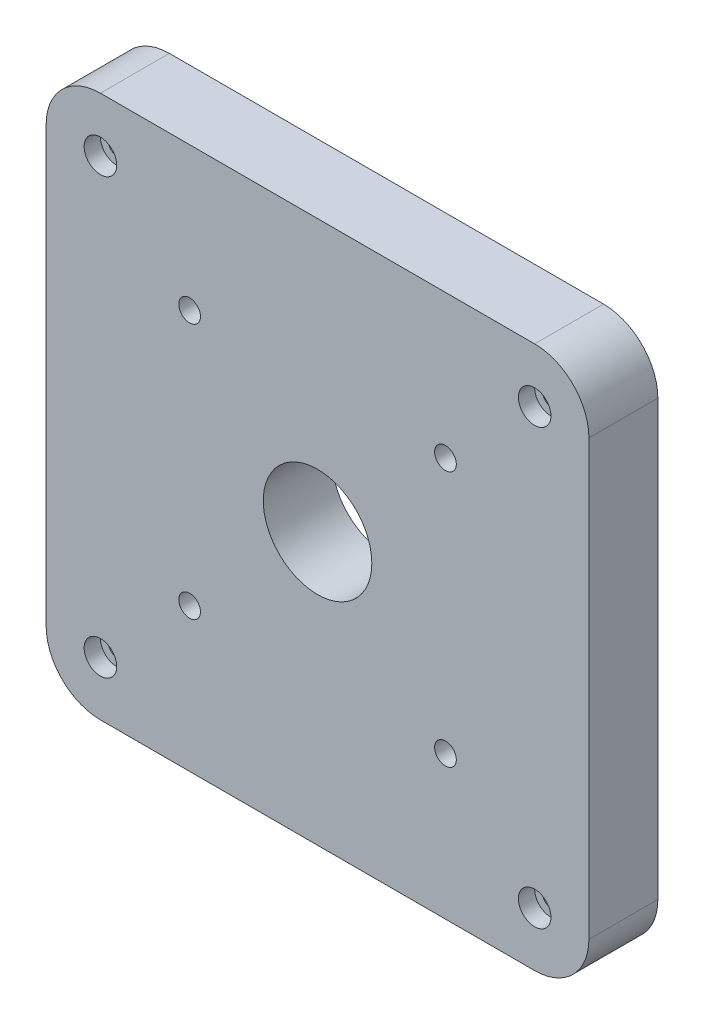
ISO-10303-21;
HEADER;
FILE_DESCRIPTION(('STEP AP214'),'2;1');
FILE_NAME('part.step','',(''),(''),'','','');
FILE_SCHEMA(('AUTOMOTIVE_DESIGN { 1 0 10303 214 1 1 1 1 }'));
ENDSEC;
DATA;
#1=APPLICATION_CONTEXT('core data for automotive mechanical design processes');
#2=APPLICATION_PROTOCOL_DEFINITION('international standard','automotive_design',2000,#1);
#3=PRODUCT_CONTEXT('',#1,'mechanical');
#4=PRODUCT('Part','Part','',(#3));
#5=PRODUCT_RELATED_PRODUCT_CATEGORY('part','',(#4));
#6=PRODUCT_DEFINITION_FORMATION('','',#4);
#7=PRODUCT_DEFINITION_CONTEXT('part definition',#1,'design');
#8=PRODUCT_DEFINITION('design','',#6,#7);
#9=PRODUCT_DEFINITION_SHAPE('','',#8);
#10=(LENGTH_UNIT() NAMED_UNIT(*) SI_UNIT(.MILLI.,.METRE.));
#11=(NAMED_UNIT(*) PLANE_ANGLE_UNIT() SI_UNIT($,.RADIAN.));
#12=(NAMED_UNIT(*) SI_UNIT($,.STERADIAN.) SOLID_ANGLE_UNIT());
#13=UNCERTAINTY_MEASURE_WITH_UNIT(LENGTH_MEASURE(1.E-05),#10,'distance_accuracy_value','');
#14=(GEOMETRIC_REPRESENTATION_CONTEXT(3) GLOBAL_UNCERTAINTY_ASSIGNED_CONTEXT((#13)) GLOBAL_UNIT_ASSIGNED_CONTEXT((#10,
#11,#12)) REPRESENTATION_CONTEXT('',''));
#15=CARTESIAN_POINT('',(0.,0.,0.));
#16=DIRECTION('',(0.,0.,1.));
#17=DIRECTION('',(1.,0.,0.));
#18=AXIS2_PLACEMENT_3D('',#15,#16,#17);
#19=CARTESIAN_POINT('',(96.43,73.57,64.4));
#20=DIRECTION('',(0.,0.,1.));
#21=DIRECTION('',(1.,0.,0.));
#22=AXIS2_PLACEMENT_3D('',#19,#20,#21);
#23=CYLINDRICAL_SURFACE('',#22,2.);
#24=CARTESIAN_POINT('',(96.43,73.57,95.4));
#25=DIRECTION('',(0.,0.,1.));
#26=DIRECTION('',(1.,0.,0.));
#27=AXIS2_PLACEMENT_3D('',#24,#25,#26);
#28=CIRCLE('',#27,2.);
#29=CARTESIAN_POINT('',(98.43,73.57,95.4));
#30=VERTEX_POINT('',#29);
#31=EDGE_CURVE('E212',#30,#30,#28,.T.);
#32=ORIENTED_EDGE('',*,*,#31,.T.);
#33=EDGE_LOOP('',(#32));
#34=FACE_BOUND('',#33,.T.);
#35=CARTESIAN_POINT('',(96.43,73.57,87.2));
#36=DIRECTION('',(0.,0.,-1.));
#37=DIRECTION('',(-1.,0.,0.));
#38=AXIS2_PLACEMENT_3D('',#35,#36,#37);
#39=CIRCLE('',#38,2.);
#40=CARTESIAN_POINT('',(94.43,73.57,87.2));
#41=VERTEX_POINT('',#40);
#42=EDGE_CURVE('E44',#41,#41,#39,.F.);
#43=ORIENTED_EDGE('',*,*,#42,.F.);
#44=EDGE_LOOP('',(#43));
#45=FACE_BOUND('',#44,.T.);
#46=ADVANCED_FACE('F40',(#34,#45),#23,.F.);
#47=CARTESIAN_POINT('',(143.57,73.57,64.4));
#48=DIRECTION('',(0.,0.,1.));
#49=DIRECTION('',(1.,0.,0.));
#50=AXIS2_PLACEMENT_3D('',#47,#48,#49);
#51=CYLINDRICAL_SURFACE('',#50,2.);
#52=CARTESIAN_POINT('',(143.57,73.57,95.4));
#53=DIRECTION('',(0.,0.,1.));
#54=DIRECTION('',(1.,0.,0.));
#55=AXIS2_PLACEMENT_3D('',#52,#53,#54);
#56=CIRCLE('',#55,2.);
#57=CARTESIAN_POINT('',(145.57,73.57,95.4));
#58=VERTEX_POINT('',#57);
#59=EDGE_CURVE('E206',#58,#58,#56,.T.);
#60=ORIENTED_EDGE('',*,*,#59,.T.);
#61=EDGE_LOOP('',(#60));
#62=FACE_BOUND('',#61,.T.);
#63=CARTESIAN_POINT('',(143.57,73.57,87.2));
#64=DIRECTION('',(0.,0.,-1.));
#65=DIRECTION('',(-1.,0.,0.));
#66=AXIS2_PLACEMENT_3D('',#63,#64,#65);
#67=CIRCLE('',#66,2.);
#68=CARTESIAN_POINT('',(141.57,73.57,87.2));
#69=VERTEX_POINT('',#68);
#70=EDGE_CURVE('E192',#69,#69,#67,.F.);
#71=ORIENTED_EDGE('',*,*,#70,.F.);
#72=EDGE_LOOP('',(#71));
#73=FACE_BOUND('',#72,.T.);
#74=ADVANCED_FACE('F278',(#62,#73),#51,.F.);
#75=CARTESIAN_POINT('',(96.43,26.43,64.4));
#76=DIRECTION('',(0.,0.,1.));
#77=DIRECTION('',(1.,0.,0.));
#78=AXIS2_PLACEMENT_3D('',#75,#76,#77);
#79=CYLINDRICAL_SURFACE('',#78,2.);
#80=CARTESIAN_POINT('',(96.43,26.43,95.4));
#81=DIRECTION('',(0.,0.,1.));
#82=DIRECTION('',(1.,0.,0.));
#83=AXIS2_PLACEMENT_3D('',#80,#81,#82);
#84=CIRCLE('',#83,2.);
#85=CARTESIAN_POINT('',(98.43,26.43,95.4));
#86=VERTEX_POINT('',#85);
#87=EDGE_CURVE('E201',#86,#86,#84,.T.);
#88=ORIENTED_EDGE('',*,*,#87,.T.);
#89=EDGE_LOOP('',(#88));
#90=FACE_BOUND('',#89,.T.);
#91=CARTESIAN_POINT('',(96.43,26.43,87.2));
#92=DIRECTION('',(0.,0.,-1.));
#93=DIRECTION('',(-1.,0.,0.));
#94=AXIS2_PLACEMENT_3D('',#91,#92,#93);
#95=CIRCLE('',#94,2.);
#96=CARTESIAN_POINT('',(94.43,26.43,87.2));
#97=VERTEX_POINT('',#96);
#98=EDGE_CURVE('E189',#97,#97,#95,.F.);
#99=ORIENTED_EDGE('',*,*,#98,.F.);
#100=EDGE_LOOP('',(#99));
#101=FACE_BOUND('',#100,.T.);
#102=ADVANCED_FACE('F284',(#90,#101),#79,.F.);
#103=CARTESIAN_POINT('',(143.57,26.43,64.4));
#104=DIRECTION('',(0.,0.,1.));
#105=DIRECTION('',(1.,0.,0.));
#106=AXIS2_PLACEMENT_3D('',#103,#104,#105);
#107=CYLINDRICAL_SURFACE('',#106,2.);
#108=CARTESIAN_POINT('',(143.57,26.43,95.4));
#109=DIRECTION('',(0.,0.,1.));
#110=DIRECTION('',(1.,0.,0.));
#111=AXIS2_PLACEMENT_3D('',#108,#109,#110);
#112=CIRCLE('',#111,2.);
#113=CARTESIAN_POINT('',(145.57,26.43,95.4));
#114=VERTEX_POINT('',#113);
#115=EDGE_CURVE('E197',#114,#114,#112,.T.);
#116=ORIENTED_EDGE('',*,*,#115,.T.);
#117=EDGE_LOOP('',(#116));
#118=FACE_BOUND('',#117,.T.);
#119=CARTESIAN_POINT('',(143.57,26.43,87.2));
#120=DIRECTION('',(0.,0.,-1.));
#121=DIRECTION('',(-1.,0.,0.));
#122=AXIS2_PLACEMENT_3D('',#119,#120,#121);
#123=CIRCLE('',#122,2.);
#124=CARTESIAN_POINT('',(141.57,26.43,87.2));
#125=VERTEX_POINT('',#124);
#126=EDGE_CURVE('E186',#125,#125,#123,.F.);
#127=ORIENTED_EDGE('',*,*,#126,.F.);
#128=EDGE_LOOP('',(#127));
#129=FACE_BOUND('',#128,.T.);
#130=ADVANCED_FACE('F295',(#118,#129),#107,.F.);
#131=CARTESIAN_POINT('',(160.,90.,95.4));
#132=DIRECTION('',(0.,0.,-1.));
#133=DIRECTION('',(-1.,0.,0.));
#134=AXIS2_PLACEMENT_3D('',#131,#132,#133);
#135=CYLINDRICAL_SURFACE('',#134,10.);
#136=CARTESIAN_POINT('',(160.,90.,82.7));
#137=DIRECTION('',(0.,0.,1.));
#138=DIRECTION('',(1.,0.,0.));
#139=AXIS2_PLACEMENT_3D('',#136,#137,#138);
#140=CIRCLE('',#139,10.);
#141=CARTESIAN_POINT('',(170.,89.9999999999999,82.7));
#142=VERTEX_POINT('',#141);
#143=CARTESIAN_POINT('',(160.,100.,82.7));
#144=VERTEX_POINT('',#143);
#145=EDGE_CURVE('E139',#142,#144,#140,.T.);
#146=ORIENTED_EDGE('',*,*,#145,.T.);
#147=DIRECTION('',(0.,0.,-1.));
#148=VECTOR('',#147,1.);
#149=CARTESIAN_POINT('',(160.,100.,95.4));
#150=LINE('',#149,#148);
#151=CARTESIAN_POINT('',(160.,100.,95.4));
#152=VERTEX_POINT('',#151);
#153=EDGE_CURVE('E11',#152,#144,#150,.T.);
#154=ORIENTED_EDGE('',*,*,#153,.F.);
#155=CARTESIAN_POINT('',(160.,90.,95.4));
#156=DIRECTION('',(0.,0.,1.));
#157=DIRECTION('',(1.,0.,0.));
#158=AXIS2_PLACEMENT_3D('',#155,#156,#157);
#159=CIRCLE('',#158,10.);
#160=CARTESIAN_POINT('',(170.,89.9999999999999,95.4));
#161=VERTEX_POINT('',#160);
#162=EDGE_CURVE('E154',#161,#152,#159,.T.);
#163=ORIENTED_EDGE('',*,*,#162,.F.);
#164=DIRECTION('',(0.,0.,-1.));
#165=VECTOR('',#164,1.);
#166=CARTESIAN_POINT('',(170.,89.9999999999999,95.4));
#167=LINE('',#166,#165);
#168=EDGE_CURVE('E135',#161,#142,#167,.T.);
#169=ORIENTED_EDGE('',*,*,#168,.T.);
#170=EDGE_LOOP('',(#146,#154,#163,#169));
#171=FACE_BOUND('',#170,.T.);
#172=ADVANCED_FACE('F42',(#171),#135,.T.);
#173=CARTESIAN_POINT('',(160.,100.,95.4));
#174=DIRECTION('',(0.,-1.,0.));
#175=DIRECTION('',(1.,0.,0.));
#176=AXIS2_PLACEMENT_3D('',#173,#174,#175);
#177=PLANE('',#176);
#178=DIRECTION('',(-1.,0.,0.));
#179=VECTOR('',#178,1.);
#180=CARTESIAN_POINT('',(160.,100.,82.7));
#181=LINE('',#180,#179);
#182=CARTESIAN_POINT('',(80.0000000000001,100.,82.7));
#183=VERTEX_POINT('',#182);
#184=EDGE_CURVE('E142',#144,#183,#181,.T.);
#185=ORIENTED_EDGE('',*,*,#184,.T.);
#186=DIRECTION('',(0.,0.,-1.));
#187=VECTOR('',#186,1.);
#188=CARTESIAN_POINT('',(80.0000000000001,100.,95.4));
#189=LINE('',#188,#187);
#190=CARTESIAN_POINT('',(80.0000000000001,100.,95.4));
#191=VERTEX_POINT('',#190);
#192=EDGE_CURVE('E50',#191,#183,#189,.T.);
#193=ORIENTED_EDGE('',*,*,#192,.F.);
#194=DIRECTION('',(-1.,0.,0.));
#195=VECTOR('',#194,1.);
#196=CARTESIAN_POINT('',(160.,100.,95.4));
#197=LINE('',#196,#195);
#198=EDGE_CURVE('E102',#152,#191,#197,.T.);
#199=ORIENTED_EDGE('',*,*,#198,.F.);
#200=ORIENTED_EDGE('',*,*,#153,.T.);
#201=EDGE_LOOP('',(#185,#193,#199,#200));
#202=FACE_BOUND('',#201,.T.);
#203=ADVANCED_FACE('F679',(#202),#177,.F.);
#204=CARTESIAN_POINT('',(80.,90.,95.4));
#205=DIRECTION('',(0.,0.,-1.));
#206=DIRECTION('',(-1.,0.,0.));
#207=AXIS2_PLACEMENT_3D('',#204,#205,#206);
#208=CYLINDRICAL_SURFACE('',#207,9.99999999999999);
#209=CARTESIAN_POINT('',(80.,90.,82.7));
#210=DIRECTION('',(0.,0.,1.));
#211=DIRECTION('',(1.,0.,0.));
#212=AXIS2_PLACEMENT_3D('',#209,#210,#211);
#213=CIRCLE('',#212,9.99999999999999);
#214=CARTESIAN_POINT('',(70.,89.9999999999999,82.7));
#215=VERTEX_POINT('',#214);
#216=EDGE_CURVE('E145',#183,#215,#213,.T.);
#217=ORIENTED_EDGE('',*,*,#216,.T.);
#218=DIRECTION('',(0.,0.,-1.));
#219=VECTOR('',#218,1.);
#220=CARTESIAN_POINT('',(70.,89.9999999999999,95.4));
#221=LINE('',#220,#219);
#222=CARTESIAN_POINT('',(70.,89.9999999999999,95.4));
#223=VERTEX_POINT('',#222);
#224=EDGE_CURVE('E161',#223,#215,#221,.T.);
#225=ORIENTED_EDGE('',*,*,#224,.F.);
#226=CARTESIAN_POINT('',(80.,90.,95.4));
#227=DIRECTION('',(0.,0.,1.));
#228=DIRECTION('',(1.,0.,0.));
#229=AXIS2_PLACEMENT_3D('',#226,#227,#228);
#230=CIRCLE('',#229,9.99999999999999);
#231=EDGE_CURVE('E246',#191,#223,#230,.T.);
#232=ORIENTED_EDGE('',*,*,#231,.F.);
#233=ORIENTED_EDGE('',*,*,#192,.T.);
#234=EDGE_LOOP('',(#217,#225,#232,#233));
#235=FACE_BOUND('',#234,.T.);
#236=ADVANCED_FACE('F670',(#235),#208,.T.);
#237=CARTESIAN_POINT('',(70.,10.0000000000001,95.4));
#238=DIRECTION('',(1.,0.,0.));
#239=DIRECTION('',(0.,0.,-1.));
#240=AXIS2_PLACEMENT_3D('',#237,#238,#239);
#241=PLANE('',#240);
#242=DIRECTION('',(0.,-1.,0.));
#243=VECTOR('',#242,1.);
#244=CARTESIAN_POINT('',(70.,10.0000000000001,82.7));
#245=LINE('',#244,#243);
#246=CARTESIAN_POINT('',(70.,9.99999999999999,82.7));
#247=VERTEX_POINT('',#246);
#248=EDGE_CURVE('E147',#215,#247,#245,.T.);
#249=ORIENTED_EDGE('',*,*,#248,.T.);
#250=DIRECTION('',(0.,0.,-1.));
#251=VECTOR('',#250,1.);
#252=CARTESIAN_POINT('',(70.,9.99999999999999,95.4));
#253=LINE('',#252,#251);
#254=CARTESIAN_POINT('',(70.,9.99999999999999,95.4));
#255=VERTEX_POINT('',#254);
#256=EDGE_CURVE('E158',#255,#247,#253,.T.);
#257=ORIENTED_EDGE('',*,*,#256,.F.);
#258=DIRECTION('',(0.,-1.,0.));
#259=VECTOR('',#258,1.);
#260=CARTESIAN_POINT('',(70.,10.0000000000001,95.4));
#261=LINE('',#260,#259);
#262=EDGE_CURVE('E248',#223,#255,#261,.T.);
#263=ORIENTED_EDGE('',*,*,#262,.F.);
#264=ORIENTED_EDGE('',*,*,#224,.T.);
#265=EDGE_LOOP('',(#249,#257,#263,#264));
#266=FACE_BOUND('',#265,.T.);
#267=ADVANCED_FACE('F254',(#266),#241,.F.);
#268=CARTESIAN_POINT('',(80.,9.99999999999999,95.4));
#269=DIRECTION('',(0.,0.,-1.));
#270=DIRECTION('',(-1.,0.,0.));
#271=AXIS2_PLACEMENT_3D('',#268,#269,#270);
#272=CYLINDRICAL_SURFACE('',#271,10.);
#273=CARTESIAN_POINT('',(80.,9.99999999999999,82.7));
#274=DIRECTION('',(0.,0.,1.));
#275=DIRECTION('',(-1.,0.,0.));
#276=AXIS2_PLACEMENT_3D('',#273,#274,#275);
#277=CIRCLE('',#276,10.);
#278=CARTESIAN_POINT('',(80.0000000000001,0.,82.7));
#279=VERTEX_POINT('',#278);
#280=EDGE_CURVE('E149',#247,#279,#277,.T.);
#281=ORIENTED_EDGE('',*,*,#280,.T.);
#282=DIRECTION('',(0.,0.,-1.));
#283=VECTOR('',#282,1.);
#284=CARTESIAN_POINT('',(80.0000000000001,0.,95.4));
#285=LINE('',#284,#283);
#286=CARTESIAN_POINT('',(80.0000000000001,0.,95.4));
#287=VERTEX_POINT('',#286);
#288=EDGE_CURVE('E130',#287,#279,#285,.T.);
#289=ORIENTED_EDGE('',*,*,#288,.F.);
#290=CARTESIAN_POINT('',(80.,9.99999999999999,95.4));
#291=DIRECTION('',(0.,0.,1.));
#292=DIRECTION('',(-1.,0.,0.));
#293=AXIS2_PLACEMENT_3D('',#290,#291,#292);
#294=CIRCLE('',#293,10.);
#295=EDGE_CURVE('E121',#255,#287,#294,.T.);
#296=ORIENTED_EDGE('',*,*,#295,.F.);
#297=ORIENTED_EDGE('',*,*,#256,.T.);
#298=EDGE_LOOP('',(#281,#289,#296,#297));
#299=FACE_BOUND('',#298,.T.);
#300=ADVANCED_FACE('F258',(#299),#272,.T.);
#301=CARTESIAN_POINT('',(160.,0.,95.4));
#302=DIRECTION('',(0.,1.,0.));
#303=DIRECTION('',(0.,0.,1.));
#304=AXIS2_PLACEMENT_3D('',#301,#302,#303);
#305=PLANE('',#304);
#306=DIRECTION('',(1.,0.,0.));
#307=VECTOR('',#306,1.);
#308=CARTESIAN_POINT('',(160.,0.,82.7));
#309=LINE('',#308,#307);
#310=CARTESIAN_POINT('',(160.,0.,82.7));
#311=VERTEX_POINT('',#310);
#312=EDGE_CURVE('E129',#279,#311,#309,.T.);
#313=ORIENTED_EDGE('',*,*,#312,.T.);
#314=DIRECTION('',(0.,0.,-1.));
#315=VECTOR('',#314,1.);
#316=CARTESIAN_POINT('',(160.,0.,95.4));
#317=LINE('',#316,#315);
#318=CARTESIAN_POINT('',(160.,0.,95.4));
#319=VERTEX_POINT('',#318);
#320=EDGE_CURVE('E126',#319,#311,#317,.T.);
#321=ORIENTED_EDGE('',*,*,#320,.F.);
#322=DIRECTION('',(1.,0.,0.));
#323=VECTOR('',#322,1.);
#324=CARTESIAN_POINT('',(160.,0.,95.4));
#325=LINE('',#324,#323);
#326=EDGE_CURVE('E115',#287,#319,#325,.T.);
#327=ORIENTED_EDGE('',*,*,#326,.F.);
#328=ORIENTED_EDGE('',*,*,#288,.T.);
#329=EDGE_LOOP('',(#313,#321,#327,#328));
#330=FACE_BOUND('',#329,.T.);
#331=ADVANCED_FACE('F127',(#330),#305,.F.);
#332=CARTESIAN_POINT('',(160.,9.99999999999999,95.4));
#333=DIRECTION('',(0.,0.,-1.));
#334=DIRECTION('',(-1.,0.,0.));
#335=AXIS2_PLACEMENT_3D('',#332,#333,#334);
#336=CYLINDRICAL_SURFACE('',#335,10.);
#337=CARTESIAN_POINT('',(160.,9.99999999999999,82.7));
#338=DIRECTION('',(0.,0.,1.));
#339=DIRECTION('',(1.,0.,0.));
#340=AXIS2_PLACEMENT_3D('',#337,#338,#339);
#341=CIRCLE('',#340,10.);
#342=CARTESIAN_POINT('',(170.,10.0000000000001,82.7));
#343=VERTEX_POINT('',#342);
#344=EDGE_CURVE('E88',#311,#343,#341,.T.);
#345=ORIENTED_EDGE('',*,*,#344,.T.);
#346=DIRECTION('',(0.,0.,-1.));
#347=VECTOR('',#346,1.);
#348=CARTESIAN_POINT('',(170.,10.0000000000001,95.4));
#349=LINE('',#348,#347);
#350=CARTESIAN_POINT('',(170.,10.0000000000001,95.4));
#351=VERTEX_POINT('',#350);
#352=EDGE_CURVE('E131',#351,#343,#349,.T.);
#353=ORIENTED_EDGE('',*,*,#352,.F.);
#354=CARTESIAN_POINT('',(160.,9.99999999999999,95.4));
#355=DIRECTION('',(0.,0.,1.));
#356=DIRECTION('',(1.,0.,0.));
#357=AXIS2_PLACEMENT_3D('',#354,#355,#356);
#358=CIRCLE('',#357,10.);
#359=EDGE_CURVE('E119',#319,#351,#358,.T.);
#360=ORIENTED_EDGE('',*,*,#359,.F.);
#361=ORIENTED_EDGE('',*,*,#320,.T.);
#362=EDGE_LOOP('',(#345,#353,#360,#361));
#363=FACE_BOUND('',#362,.T.);
#364=ADVANCED_FACE('F133',(#363),#336,.T.);
#365=CARTESIAN_POINT('',(170.,10.0000000000001,95.4));
#366=DIRECTION('',(-1.,0.,0.));
#367=DIRECTION('',(0.,0.,1.));
#368=AXIS2_PLACEMENT_3D('',#365,#366,#367);
#369=PLANE('',#368);
#370=DIRECTION('',(0.,1.,0.));
#371=VECTOR('',#370,1.);
#372=CARTESIAN_POINT('',(170.,10.0000000000001,82.7));
#373=LINE('',#372,#371);
#374=EDGE_CURVE('E94',#343,#142,#373,.T.);
#375=ORIENTED_EDGE('',*,*,#374,.T.);
#376=ORIENTED_EDGE('',*,*,#168,.F.);
#377=DIRECTION('',(0.,1.,0.));
#378=VECTOR('',#377,1.);
#379=CARTESIAN_POINT('',(170.,10.0000000000001,95.4));
#380=LINE('',#379,#378);
#381=EDGE_CURVE('E59',#351,#161,#380,.T.);
#382=ORIENTED_EDGE('',*,*,#381,.F.);
#383=ORIENTED_EDGE('',*,*,#352,.T.);
#384=EDGE_LOOP('',(#375,#376,#382,#383));
#385=FACE_BOUND('',#384,.T.);
#386=ADVANCED_FACE('F266',(#385),#369,.F.);
#387=CARTESIAN_POINT('',(160.,90.,95.4));
#388=DIRECTION('',(0.,0.,1.));
#389=DIRECTION('',(1.,0.,0.));
#390=AXIS2_PLACEMENT_3D('',#387,#388,#389);
#391=PLANE('',#390);
#392=ORIENTED_EDGE('',*,*,#115,.F.);
#393=EDGE_LOOP('',(#392));
#394=FACE_BOUND('',#393,.T.);
#395=ORIENTED_EDGE('',*,*,#87,.F.);
#396=EDGE_LOOP('',(#395));
#397=FACE_BOUND('',#396,.T.);
#398=ORIENTED_EDGE('',*,*,#59,.F.);
#399=EDGE_LOOP('',(#398));
#400=FACE_BOUND('',#399,.T.);
#401=ORIENTED_EDGE('',*,*,#31,.F.);
#402=EDGE_LOOP('',(#401));
#403=FACE_BOUND('',#402,.T.);
#404=CARTESIAN_POINT('',(120.,50.,95.4));
#405=DIRECTION('',(0.,0.,1.));
#406=DIRECTION('',(1.,0.,0.));
#407=AXIS2_PLACEMENT_3D('',#404,#405,#406);
#408=CIRCLE('',#407,9.99999999999999);
#409=CARTESIAN_POINT('',(130.,50.,95.4));
#410=VERTEX_POINT('',#409);
#411=EDGE_CURVE('E185',#410,#410,#408,.T.);
#412=ORIENTED_EDGE('',*,*,#411,.F.);
#413=EDGE_LOOP('',(#412));
#414=FACE_BOUND('',#413,.T.);
#415=CARTESIAN_POINT('',(80.,9.99999999999999,95.4));
#416=DIRECTION('',(0.,0.,1.));
#417=DIRECTION('',(1.,0.,0.));
#418=AXIS2_PLACEMENT_3D('',#415,#416,#417);
#419=CIRCLE('',#418,3.00000000000001);
#420=CARTESIAN_POINT('',(83.,9.99999999999999,95.4));
#421=VERTEX_POINT('',#420);
#422=EDGE_CURVE('E235',#421,#421,#419,.T.);
#423=ORIENTED_EDGE('',*,*,#422,.F.);
#424=EDGE_LOOP('',(#423));
#425=FACE_BOUND('',#424,.T.);
#426=CARTESIAN_POINT('',(160.,9.99999999999999,95.4));
#427=DIRECTION('',(0.,0.,1.));
#428=DIRECTION('',(1.,0.,0.));
#429=AXIS2_PLACEMENT_3D('',#426,#427,#428);
#430=CIRCLE('',#429,2.99999999999999);
#431=CARTESIAN_POINT('',(163.,9.99999999999999,95.4));
#432=VERTEX_POINT('',#431);
#433=EDGE_CURVE('E229',#432,#432,#430,.T.);
#434=ORIENTED_EDGE('',*,*,#433,.F.);
#435=EDGE_LOOP('',(#434));
#436=FACE_BOUND('',#435,.T.);
#437=CARTESIAN_POINT('',(160.,90.,95.4));
#438=DIRECTION('',(0.,0.,1.));
#439=DIRECTION('',(1.,0.,0.));
#440=AXIS2_PLACEMENT_3D('',#437,#438,#439);
#441=CIRCLE('',#440,2.99999999999999);
#442=CARTESIAN_POINT('',(163.,90.,95.4));
#443=VERTEX_POINT('',#442);
#444=EDGE_CURVE('E222',#443,#443,#441,.T.);
#445=ORIENTED_EDGE('',*,*,#444,.F.);
#446=EDGE_LOOP('',(#445));
#447=FACE_BOUND('',#446,.T.);
#448=CARTESIAN_POINT('',(80.,90.,95.4));
#449=DIRECTION('',(0.,0.,1.));
#450=DIRECTION('',(1.,0.,0.));
#451=AXIS2_PLACEMENT_3D('',#448,#449,#450);
#452=CIRCLE('',#451,3.00000000000001);
#453=CARTESIAN_POINT('',(83.,90.,95.4));
#454=VERTEX_POINT('',#453);
#455=EDGE_CURVE('E225',#454,#454,#452,.T.);
#456=ORIENTED_EDGE('',*,*,#455,.F.);
#457=EDGE_LOOP('',(#456));
#458=FACE_BOUND('',#457,.T.);
#459=ORIENTED_EDGE('',*,*,#162,.T.);
#460=ORIENTED_EDGE('',*,*,#198,.T.);
#461=ORIENTED_EDGE('',*,*,#231,.T.);
#462=ORIENTED_EDGE('',*,*,#262,.T.);
#463=ORIENTED_EDGE('',*,*,#295,.T.);
#464=ORIENTED_EDGE('',*,*,#326,.T.);
#465=ORIENTED_EDGE('',*,*,#359,.T.);
#466=ORIENTED_EDGE('',*,*,#381,.T.);
#467=EDGE_LOOP('',(#459,#460,#461,#462,#463,#464,#465,#466));
#468=FACE_BOUND('',#467,.T.);
#469=ADVANCED_FACE('F117',(#394,#397,#400,#403,#414,#425,#436,#447,#458,#468),#391,.T.);
#470=CARTESIAN_POINT('',(160.,90.,82.7));
#471=DIRECTION('',(0.,0.,1.));
#472=DIRECTION('',(1.,0.,0.));
#473=AXIS2_PLACEMENT_3D('',#470,#471,#472);
#474=PLANE('',#473);
#475=CARTESIAN_POINT('',(96.43,73.57,82.7));
#476=DIRECTION('',(0.,0.,-1.));
#477=DIRECTION('',(-1.,0.,0.));
#478=AXIS2_PLACEMENT_3D('',#475,#476,#477);
#479=CIRCLE('',#478,4.00000000000001);
#480=CARTESIAN_POINT('',(92.43,73.57,82.7));
#481=VERTEX_POINT('',#480);
#482=EDGE_CURVE('E358',#481,#481,#479,.T.);
#483=ORIENTED_EDGE('',*,*,#482,.F.);
#484=EDGE_LOOP('',(#483));
#485=FACE_BOUND('',#484,.T.);
#486=CARTESIAN_POINT('',(143.57,26.43,82.7));
#487=DIRECTION('',(0.,0.,-1.));
#488=DIRECTION('',(-1.,0.,0.));
#489=AXIS2_PLACEMENT_3D('',#486,#487,#488);
#490=CIRCLE('',#489,3.99999999999999);
#491=CARTESIAN_POINT('',(139.57,26.43,82.7));
#492=VERTEX_POINT('',#491);
#493=EDGE_CURVE('E362',#492,#492,#490,.T.);
#494=ORIENTED_EDGE('',*,*,#493,.F.);
#495=EDGE_LOOP('',(#494));
#496=FACE_BOUND('',#495,.T.);
#497=CARTESIAN_POINT('',(96.43,26.43,82.7));
#498=DIRECTION('',(0.,0.,-1.));
#499=DIRECTION('',(-1.,0.,0.));
#500=AXIS2_PLACEMENT_3D('',#497,#498,#499);
#501=CIRCLE('',#500,4.00000000000001);
#502=CARTESIAN_POINT('',(92.43,26.43,82.7));
#503=VERTEX_POINT('',#502);
#504=EDGE_CURVE('E366',#503,#503,#501,.T.);
#505=ORIENTED_EDGE('',*,*,#504,.F.);
#506=EDGE_LOOP('',(#505));
#507=FACE_BOUND('',#506,.T.);
#508=CARTESIAN_POINT('',(143.57,73.57,82.7));
#509=DIRECTION('',(0.,0.,-1.));
#510=DIRECTION('',(-1.,0.,0.));
#511=AXIS2_PLACEMENT_3D('',#508,#509,#510);
#512=CIRCLE('',#511,3.99999999999999);
#513=CARTESIAN_POINT('',(139.57,73.57,82.7));
#514=VERTEX_POINT('',#513);
#515=EDGE_CURVE('E370',#514,#514,#512,.T.);
#516=ORIENTED_EDGE('',*,*,#515,.F.);
#517=EDGE_LOOP('',(#516));
#518=FACE_BOUND('',#517,.T.);
#519=CARTESIAN_POINT('',(120.,50.,82.7));
#520=DIRECTION('',(0.,0.,1.));
#521=DIRECTION('',(1.,0.,0.));
#522=AXIS2_PLACEMENT_3D('',#519,#520,#521);
#523=CIRCLE('',#522,9.99999999999999);
#524=CARTESIAN_POINT('',(130.,50.,82.7));
#525=VERTEX_POINT('',#524);
#526=EDGE_CURVE('E170',#525,#525,#523,.T.);
#527=ORIENTED_EDGE('',*,*,#526,.T.);
#528=EDGE_LOOP('',(#527));
#529=FACE_BOUND('',#528,.T.);
#530=CARTESIAN_POINT('',(80.,9.99999999999999,82.7));
#531=DIRECTION('',(0.,0.,1.));
#532=DIRECTION('',(1.,0.,0.));
#533=AXIS2_PLACEMENT_3D('',#530,#531,#532);
#534=CIRCLE('',#533,1.5);
#535=CARTESIAN_POINT('',(81.5,9.99999999999999,82.7));
#536=VERTEX_POINT('',#535);
#537=EDGE_CURVE('E169',#536,#536,#534,.T.);
#538=ORIENTED_EDGE('',*,*,#537,.T.);
#539=EDGE_LOOP('',(#538));
#540=FACE_BOUND('',#539,.T.);
#541=CARTESIAN_POINT('',(160.,9.99999999999999,82.7));
#542=DIRECTION('',(0.,0.,1.));
#543=DIRECTION('',(1.,0.,0.));
#544=AXIS2_PLACEMENT_3D('',#541,#542,#543);
#545=CIRCLE('',#544,1.5);
#546=CARTESIAN_POINT('',(161.5,9.99999999999999,82.7));
#547=VERTEX_POINT('',#546);
#548=EDGE_CURVE('E174',#547,#547,#545,.T.);
#549=ORIENTED_EDGE('',*,*,#548,.T.);
#550=EDGE_LOOP('',(#549));
#551=FACE_BOUND('',#550,.T.);
#552=CARTESIAN_POINT('',(160.,90.,82.7));
#553=DIRECTION('',(0.,0.,1.));
#554=DIRECTION('',(1.,0.,0.));
#555=AXIS2_PLACEMENT_3D('',#552,#553,#554);
#556=CIRCLE('',#555,1.5);
#557=CARTESIAN_POINT('',(161.5,90.,82.7));
#558=VERTEX_POINT('',#557);
#559=EDGE_CURVE('E178',#558,#558,#556,.T.);
#560=ORIENTED_EDGE('',*,*,#559,.T.);
#561=EDGE_LOOP('',(#560));
#562=FACE_BOUND('',#561,.T.);
#563=CARTESIAN_POINT('',(80.,90.,82.7));
#564=DIRECTION('',(0.,0.,1.));
#565=DIRECTION('',(1.,0.,0.));
#566=AXIS2_PLACEMENT_3D('',#563,#564,#565);
#567=CIRCLE('',#566,1.5);
#568=CARTESIAN_POINT('',(81.5,90.,82.7));
#569=VERTEX_POINT('',#568);
#570=EDGE_CURVE('E182',#569,#569,#567,.T.);
#571=ORIENTED_EDGE('',*,*,#570,.T.);
#572=EDGE_LOOP('',(#571));
#573=FACE_BOUND('',#572,.T.);
#574=ORIENTED_EDGE('',*,*,#145,.F.);
#575=ORIENTED_EDGE('',*,*,#374,.F.);
#576=ORIENTED_EDGE('',*,*,#344,.F.);
#577=ORIENTED_EDGE('',*,*,#312,.F.);
#578=ORIENTED_EDGE('',*,*,#280,.F.);
#579=ORIENTED_EDGE('',*,*,#248,.F.);
#580=ORIENTED_EDGE('',*,*,#216,.F.);
#581=ORIENTED_EDGE('',*,*,#184,.F.);
#582=EDGE_LOOP('',(#574,#575,#576,#577,#578,#579,#580,#581));
#583=FACE_BOUND('',#582,.T.);
#584=ADVANCED_FACE('F261',(#485,#496,#507,#518,#529,#540,#551,#562,#573,#583),#474,.F.);
#585=CARTESIAN_POINT('',(80.,90.,92.4));
#586=DIRECTION('',(0.,0.,1.));
#587=DIRECTION('',(1.,0.,0.));
#588=AXIS2_PLACEMENT_3D('',#585,#586,#587);
#589=CYLINDRICAL_SURFACE('',#588,3.00000000000001);
#590=CARTESIAN_POINT('',(80.,90.,92.4));
#591=DIRECTION('',(0.,0.,1.));
#592=DIRECTION('',(1.,0.,0.));
#593=AXIS2_PLACEMENT_3D('',#590,#591,#592);
#594=CIRCLE('',#593,3.00000000000001);
#595=CARTESIAN_POINT('',(83.,90.,92.4));
#596=VERTEX_POINT('',#595);
#597=EDGE_CURVE('E143',#596,#596,#594,.T.);
#598=ORIENTED_EDGE('',*,*,#597,.F.);
#599=EDGE_LOOP('',(#598));
#600=FACE_BOUND('',#599,.T.);
#601=ORIENTED_EDGE('',*,*,#455,.T.);
#602=EDGE_LOOP('',(#601));
#603=FACE_BOUND('',#602,.T.);
#604=ADVANCED_FACE('F347',(#600,#603),#589,.F.);
#605=CARTESIAN_POINT('',(80.,90.,92.4));
#606=DIRECTION('',(0.,0.,1.));
#607=DIRECTION('',(1.,0.,0.));
#608=AXIS2_PLACEMENT_3D('',#605,#606,#607);
#609=PLANE('',#608);
#610=CARTESIAN_POINT('',(80.,90.,92.4));
#611=DIRECTION('',(0.,0.,1.));
#612=DIRECTION('',(1.,0.,0.));
#613=AXIS2_PLACEMENT_3D('',#610,#611,#612);
#614=CIRCLE('',#613,1.5);
#615=CARTESIAN_POINT('',(81.5,90.,92.4));
#616=VERTEX_POINT('',#615);
#617=EDGE_CURVE('E179',#616,#616,#614,.T.);
#618=ORIENTED_EDGE('',*,*,#617,.F.);
#619=EDGE_LOOP('',(#618));
#620=FACE_BOUND('',#619,.T.);
#621=ORIENTED_EDGE('',*,*,#597,.T.);
#622=EDGE_LOOP('',(#621));
#623=FACE_BOUND('',#622,.T.);
#624=ADVANCED_FACE('F325',(#620,#623),#609,.T.);
#625=CARTESIAN_POINT('',(160.,90.,92.4));
#626=DIRECTION('',(0.,0.,1.));
#627=DIRECTION('',(1.,0.,0.));
#628=AXIS2_PLACEMENT_3D('',#625,#626,#627);
#629=CYLINDRICAL_SURFACE('',#628,2.99999999999999);
#630=CARTESIAN_POINT('',(160.,90.,92.4));
#631=DIRECTION('',(0.,0.,1.));
#632=DIRECTION('',(1.,0.,0.));
#633=AXIS2_PLACEMENT_3D('',#630,#631,#632);
#634=CIRCLE('',#633,2.99999999999999);
#635=CARTESIAN_POINT('',(163.,90.,92.4));
#636=VERTEX_POINT('',#635);
#637=EDGE_CURVE('E226',#636,#636,#634,.T.);
#638=ORIENTED_EDGE('',*,*,#637,.F.);
#639=EDGE_LOOP('',(#638));
#640=FACE_BOUND('',#639,.T.);
#641=ORIENTED_EDGE('',*,*,#444,.T.);
#642=EDGE_LOOP('',(#641));
#643=FACE_BOUND('',#642,.T.);
#644=ADVANCED_FACE('F321',(#640,#643),#629,.F.);
#645=CARTESIAN_POINT('',(160.,90.,92.4));
#646=DIRECTION('',(0.,0.,1.));
#647=DIRECTION('',(1.,0.,0.));
#648=AXIS2_PLACEMENT_3D('',#645,#646,#647);
#649=PLANE('',#648);
#650=CARTESIAN_POINT('',(160.,90.,92.4));
#651=DIRECTION('',(0.,0.,1.));
#652=DIRECTION('',(1.,0.,0.));
#653=AXIS2_PLACEMENT_3D('',#650,#651,#652);
#654=CIRCLE('',#653,1.5);
#655=CARTESIAN_POINT('',(161.5,90.,92.4));
#656=VERTEX_POINT('',#655);
#657=EDGE_CURVE('E175',#656,#656,#654,.T.);
#658=ORIENTED_EDGE('',*,*,#657,.F.);
#659=EDGE_LOOP('',(#658));
#660=FACE_BOUND('',#659,.T.);
#661=ORIENTED_EDGE('',*,*,#637,.T.);
#662=EDGE_LOOP('',(#661));
#663=FACE_BOUND('',#662,.T.);
#664=ADVANCED_FACE('F324',(#660,#663),#649,.T.);
#665=CARTESIAN_POINT('',(160.,9.99999999999999,92.4));
#666=DIRECTION('',(0.,0.,1.));
#667=DIRECTION('',(1.,0.,0.));
#668=AXIS2_PLACEMENT_3D('',#665,#666,#667);
#669=CYLINDRICAL_SURFACE('',#668,2.99999999999999);
#670=CARTESIAN_POINT('',(160.,9.99999999999999,92.4));
#671=DIRECTION('',(0.,0.,1.));
#672=DIRECTION('',(1.,0.,0.));
#673=AXIS2_PLACEMENT_3D('',#670,#671,#672);
#674=CIRCLE('',#673,2.99999999999999);
#675=CARTESIAN_POINT('',(163.,9.99999999999999,92.4));
#676=VERTEX_POINT('',#675);
#677=EDGE_CURVE('E232',#676,#676,#674,.T.);
#678=ORIENTED_EDGE('',*,*,#677,.F.);
#679=EDGE_LOOP('',(#678));
#680=FACE_BOUND('',#679,.T.);
#681=ORIENTED_EDGE('',*,*,#433,.T.);
#682=EDGE_LOOP('',(#681));
#683=FACE_BOUND('',#682,.T.);
#684=ADVANCED_FACE('F329',(#680,#683),#669,.F.);
#685=CARTESIAN_POINT('',(160.,9.99999999999999,92.4));
#686=DIRECTION('',(0.,0.,1.));
#687=DIRECTION('',(1.,0.,0.));
#688=AXIS2_PLACEMENT_3D('',#685,#686,#687);
#689=PLANE('',#688);
#690=CARTESIAN_POINT('',(160.,9.99999999999999,92.4));
#691=DIRECTION('',(0.,0.,1.));
#692=DIRECTION('',(1.,0.,0.));
#693=AXIS2_PLACEMENT_3D('',#690,#691,#692);
#694=CIRCLE('',#693,1.5);
#695=CARTESIAN_POINT('',(161.5,9.99999999999999,92.4));
#696=VERTEX_POINT('',#695);
#697=EDGE_CURVE('E171',#696,#696,#694,.T.);
#698=ORIENTED_EDGE('',*,*,#697,.F.);
#699=EDGE_LOOP('',(#698));
#700=FACE_BOUND('',#699,.T.);
#701=ORIENTED_EDGE('',*,*,#677,.T.);
#702=EDGE_LOOP('',(#701));
#703=FACE_BOUND('',#702,.T.);
#704=ADVANCED_FACE('F333',(#700,#703),#689,.T.);
#705=CARTESIAN_POINT('',(80.,9.99999999999999,92.4));
#706=DIRECTION('',(0.,0.,1.));
#707=DIRECTION('',(1.,0.,0.));
#708=AXIS2_PLACEMENT_3D('',#705,#706,#707);
#709=CYLINDRICAL_SURFACE('',#708,3.00000000000001);
#710=CARTESIAN_POINT('',(80.,9.99999999999999,92.4));
#711=DIRECTION('',(0.,0.,1.));
#712=DIRECTION('',(1.,0.,0.));
#713=AXIS2_PLACEMENT_3D('',#710,#711,#712);
#714=CIRCLE('',#713,3.00000000000001);
#715=CARTESIAN_POINT('',(83.,9.99999999999999,92.4));
#716=VERTEX_POINT('',#715);
#717=EDGE_CURVE('E221',#716,#716,#714,.T.);
#718=ORIENTED_EDGE('',*,*,#717,.F.);
#719=EDGE_LOOP('',(#718));
#720=FACE_BOUND('',#719,.T.);
#721=ORIENTED_EDGE('',*,*,#422,.T.);
#722=EDGE_LOOP('',(#721));
#723=FACE_BOUND('',#722,.T.);
#724=ADVANCED_FACE('F337',(#720,#723),#709,.F.);
#725=CARTESIAN_POINT('',(80.,9.99999999999999,92.4));
#726=DIRECTION('',(0.,0.,1.));
#727=DIRECTION('',(1.,0.,0.));
#728=AXIS2_PLACEMENT_3D('',#725,#726,#727);
#729=PLANE('',#728);
#730=CARTESIAN_POINT('',(80.,9.99999999999999,92.4));
#731=DIRECTION('',(0.,0.,1.));
#732=DIRECTION('',(1.,0.,0.));
#733=AXIS2_PLACEMENT_3D('',#730,#731,#732);
#734=CIRCLE('',#733,1.5);
#735=CARTESIAN_POINT('',(81.5,9.99999999999999,92.4));
#736=VERTEX_POINT('',#735);
#737=EDGE_CURVE('E166',#736,#736,#734,.T.);
#738=ORIENTED_EDGE('',*,*,#737,.F.);
#739=EDGE_LOOP('',(#738));
#740=FACE_BOUND('',#739,.T.);
#741=ORIENTED_EDGE('',*,*,#717,.T.);
#742=EDGE_LOOP('',(#741));
#743=FACE_BOUND('',#742,.T.);
#744=ADVANCED_FACE('F316',(#740,#743),#729,.T.);
#745=CARTESIAN_POINT('',(80.,9.99999999999999,65.4));
#746=DIRECTION('',(0.,0.,1.));
#747=DIRECTION('',(1.,0.,0.));
#748=AXIS2_PLACEMENT_3D('',#745,#746,#747);
#749=CYLINDRICAL_SURFACE('',#748,1.5);
#750=ORIENTED_EDGE('',*,*,#737,.T.);
#751=EDGE_LOOP('',(#750));
#752=FACE_BOUND('',#751,.T.);
#753=ORIENTED_EDGE('',*,*,#537,.F.);
#754=EDGE_LOOP('',(#753));
#755=FACE_BOUND('',#754,.T.);
#756=ADVANCED_FACE('F312',(#752,#755),#749,.F.);
#757=CARTESIAN_POINT('',(160.,9.99999999999999,65.4));
#758=DIRECTION('',(0.,0.,1.));
#759=DIRECTION('',(1.,0.,0.));
#760=AXIS2_PLACEMENT_3D('',#757,#758,#759);
#761=CYLINDRICAL_SURFACE('',#760,1.5);
#762=ORIENTED_EDGE('',*,*,#697,.T.);
#763=EDGE_LOOP('',(#762));
#764=FACE_BOUND('',#763,.T.);
#765=ORIENTED_EDGE('',*,*,#548,.F.);
#766=EDGE_LOOP('',(#765));
#767=FACE_BOUND('',#766,.T.);
#768=ADVANCED_FACE('F308',(#764,#767),#761,.F.);
#769=CARTESIAN_POINT('',(160.,90.,65.4));
#770=DIRECTION('',(0.,0.,1.));
#771=DIRECTION('',(1.,0.,0.));
#772=AXIS2_PLACEMENT_3D('',#769,#770,#771);
#773=CYLINDRICAL_SURFACE('',#772,1.5);
#774=ORIENTED_EDGE('',*,*,#657,.T.);
#775=EDGE_LOOP('',(#774));
#776=FACE_BOUND('',#775,.T.);
#777=ORIENTED_EDGE('',*,*,#559,.F.);
#778=EDGE_LOOP('',(#777));
#779=FACE_BOUND('',#778,.T.);
#780=ADVANCED_FACE('F305',(#776,#779),#773,.F.);
#781=CARTESIAN_POINT('',(80.,90.,65.4));
#782=DIRECTION('',(0.,0.,1.));
#783=DIRECTION('',(1.,0.,0.));
#784=AXIS2_PLACEMENT_3D('',#781,#782,#783);
#785=CYLINDRICAL_SURFACE('',#784,1.5);
#786=ORIENTED_EDGE('',*,*,#617,.T.);
#787=EDGE_LOOP('',(#786));
#788=FACE_BOUND('',#787,.T.);
#789=ORIENTED_EDGE('',*,*,#570,.F.);
#790=EDGE_LOOP('',(#789));
#791=FACE_BOUND('',#790,.T.);
#792=ADVANCED_FACE('F303',(#788,#791),#785,.F.);
#793=CARTESIAN_POINT('',(120.,50.,64.4));
#794=DIRECTION('',(0.,0.,1.));
#795=DIRECTION('',(1.,0.,0.));
#796=AXIS2_PLACEMENT_3D('',#793,#794,#795);
#797=CYLINDRICAL_SURFACE('',#796,9.99999999999999);
#798=ORIENTED_EDGE('',*,*,#411,.T.);
#799=EDGE_LOOP('',(#798));
#800=FACE_BOUND('',#799,.T.);
#801=ORIENTED_EDGE('',*,*,#526,.F.);
#802=EDGE_LOOP('',(#801));
#803=FACE_BOUND('',#802,.T.);
#804=ADVANCED_FACE('F299',(#800,#803),#797,.F.);
#805=CARTESIAN_POINT('',(143.57,26.43,87.2));
#806=DIRECTION('',(0.,0.,-1.));
#807=DIRECTION('',(-1.,0.,0.));
#808=AXIS2_PLACEMENT_3D('',#805,#806,#807);
#809=PLANE('',#808);
#810=CARTESIAN_POINT('',(143.57,26.43,87.2));
#811=DIRECTION('',(0.,0.,-1.));
#812=DIRECTION('',(-1.,0.,0.));
#813=AXIS2_PLACEMENT_3D('',#810,#811,#812);
#814=CIRCLE('',#813,3.99999999999999);
#815=CARTESIAN_POINT('',(139.57,26.43,87.2));
#816=VERTEX_POINT('',#815);
#817=EDGE_CURVE('E413',#816,#816,#814,.T.);
#818=ORIENTED_EDGE('',*,*,#817,.T.);
#819=EDGE_LOOP('',(#818));
#820=FACE_BOUND('',#819,.T.);
#821=ORIENTED_EDGE('',*,*,#126,.T.);
#822=EDGE_LOOP('',(#821));
#823=FACE_BOUND('',#822,.T.);
#824=ADVANCED_FACE('F302',(#820,#823),#809,.T.);
#825=CARTESIAN_POINT('',(143.57,26.43,87.2));
#826=DIRECTION('',(0.,0.,-1.));
#827=DIRECTION('',(-1.,0.,0.));
#828=AXIS2_PLACEMENT_3D('',#825,#826,#827);
#829=CYLINDRICAL_SURFACE('',#828,3.99999999999999);
#830=ORIENTED_EDGE('',*,*,#817,.F.);
#831=EDGE_LOOP('',(#830));
#832=FACE_BOUND('',#831,.T.);
#833=ORIENTED_EDGE('',*,*,#493,.T.);
#834=EDGE_LOOP('',(#833));
#835=FACE_BOUND('',#834,.T.);
#836=ADVANCED_FACE('F434',(#832,#835),#829,.F.);
#837=CARTESIAN_POINT('',(96.43,26.43,87.2));
#838=DIRECTION('',(0.,0.,-1.));
#839=DIRECTION('',(-1.,0.,0.));
#840=AXIS2_PLACEMENT_3D('',#837,#838,#839);
#841=PLANE('',#840);
#842=CARTESIAN_POINT('',(96.43,26.43,87.2));
#843=DIRECTION('',(0.,0.,-1.));
#844=DIRECTION('',(-1.,0.,0.));
#845=AXIS2_PLACEMENT_3D('',#842,#843,#844);
#846=CIRCLE('',#845,4.00000000000001);
#847=CARTESIAN_POINT('',(92.43,26.43,87.2));
#848=VERTEX_POINT('',#847);
#849=EDGE_CURVE('E419',#848,#848,#846,.T.);
#850=ORIENTED_EDGE('',*,*,#849,.T.);
#851=EDGE_LOOP('',(#850));
#852=FACE_BOUND('',#851,.T.);
#853=ORIENTED_EDGE('',*,*,#98,.T.);
#854=EDGE_LOOP('',(#853));
#855=FACE_BOUND('',#854,.T.);
#856=ADVANCED_FACE('F426',(#852,#855),#841,.T.);
#857=CARTESIAN_POINT('',(96.43,26.43,87.2));
#858=DIRECTION('',(0.,0.,-1.));
#859=DIRECTION('',(-1.,0.,0.));
#860=AXIS2_PLACEMENT_3D('',#857,#858,#859);
#861=CYLINDRICAL_SURFACE('',#860,4.00000000000001);
#862=ORIENTED_EDGE('',*,*,#849,.F.);
#863=EDGE_LOOP('',(#862));
#864=FACE_BOUND('',#863,.T.);
#865=ORIENTED_EDGE('',*,*,#504,.T.);
#866=EDGE_LOOP('',(#865));
#867=FACE_BOUND('',#866,.T.);
#868=ADVANCED_FACE('F423',(#864,#867),#861,.F.);
#869=CARTESIAN_POINT('',(143.57,73.57,87.2));
#870=DIRECTION('',(0.,0.,-1.));
#871=DIRECTION('',(-1.,0.,0.));
#872=AXIS2_PLACEMENT_3D('',#869,#870,#871);
#873=PLANE('',#872);
#874=CARTESIAN_POINT('',(143.57,73.57,87.2));
#875=DIRECTION('',(0.,0.,-1.));
#876=DIRECTION('',(-1.,0.,0.));
#877=AXIS2_PLACEMENT_3D('',#874,#875,#876);
#878=CIRCLE('',#877,3.99999999999999);
#879=CARTESIAN_POINT('',(139.57,73.57,87.2));
#880=VERTEX_POINT('',#879);
#881=EDGE_CURVE('E190',#880,#880,#878,.T.);
#882=ORIENTED_EDGE('',*,*,#881,.T.);
#883=EDGE_LOOP('',(#882));
#884=FACE_BOUND('',#883,.T.);
#885=ORIENTED_EDGE('',*,*,#70,.T.);
#886=EDGE_LOOP('',(#885));
#887=FACE_BOUND('',#886,.T.);
#888=ADVANCED_FACE('F425',(#884,#887),#873,.T.);
#889=CARTESIAN_POINT('',(143.57,73.57,87.2));
#890=DIRECTION('',(0.,0.,-1.));
#891=DIRECTION('',(-1.,0.,0.));
#892=AXIS2_PLACEMENT_3D('',#889,#890,#891);
#893=CYLINDRICAL_SURFACE('',#892,3.99999999999999);
#894=ORIENTED_EDGE('',*,*,#881,.F.);
#895=EDGE_LOOP('',(#894));
#896=FACE_BOUND('',#895,.T.);
#897=ORIENTED_EDGE('',*,*,#515,.T.);
#898=EDGE_LOOP('',(#897));
#899=FACE_BOUND('',#898,.T.);
#900=ADVANCED_FACE('F290',(#896,#899),#893,.F.);
#901=CARTESIAN_POINT('',(96.43,73.57,87.2));
#902=DIRECTION('',(0.,0.,-1.));
#903=DIRECTION('',(-1.,0.,0.));
#904=AXIS2_PLACEMENT_3D('',#901,#902,#903);
#905=PLANE('',#904);
#906=CARTESIAN_POINT('',(96.43,73.57,87.2));
#907=DIRECTION('',(0.,0.,-1.));
#908=DIRECTION('',(-1.,0.,0.));
#909=AXIS2_PLACEMENT_3D('',#906,#907,#908);
#910=CIRCLE('',#909,4.00000000000001);
#911=CARTESIAN_POINT('',(92.43,73.57,87.2));
#912=VERTEX_POINT('',#911);
#913=EDGE_CURVE('E389',#912,#912,#910,.T.);
#914=ORIENTED_EDGE('',*,*,#913,.T.);
#915=EDGE_LOOP('',(#914));
#916=FACE_BOUND('',#915,.T.);
#917=ORIENTED_EDGE('',*,*,#42,.T.);
#918=EDGE_LOOP('',(#917));
#919=FACE_BOUND('',#918,.T.);
#920=ADVANCED_FACE('F442',(#916,#919),#905,.T.);
#921=CARTESIAN_POINT('',(96.43,73.57,87.2));
#922=DIRECTION('',(0.,0.,-1.));
#923=DIRECTION('',(-1.,0.,0.));
#924=AXIS2_PLACEMENT_3D('',#921,#922,#923);
#925=CYLINDRICAL_SURFACE('',#924,4.00000000000001);
#926=ORIENTED_EDGE('',*,*,#913,.F.);
#927=EDGE_LOOP('',(#926));
#928=FACE_BOUND('',#927,.T.);
#929=ORIENTED_EDGE('',*,*,#482,.T.);
#930=EDGE_LOOP('',(#929));
#931=FACE_BOUND('',#930,.T.);
#932=ADVANCED_FACE('F439',(#928,#931),#925,.F.);
#933=CLOSED_SHELL('',(#46,#74,#102,#130,#172,#203,#236,#267,#300,#331,#364,#386,#469,#584,#604,
#624,#644,#664,#684,#704,#724,#744,#756,#768,#780,#792,#804,#824,#836,#856,#868,#888,#900,#920,#932));
#934=MANIFOLD_SOLID_BREP('B2',#933);
#935=ADVANCED_BREP_SHAPE_REPRESENTATION('',(#18,#934),#14);
#936=SHAPE_DEFINITION_REPRESENTATION(#9,#935);
ENDSEC;
END-ISO-10303-21;
